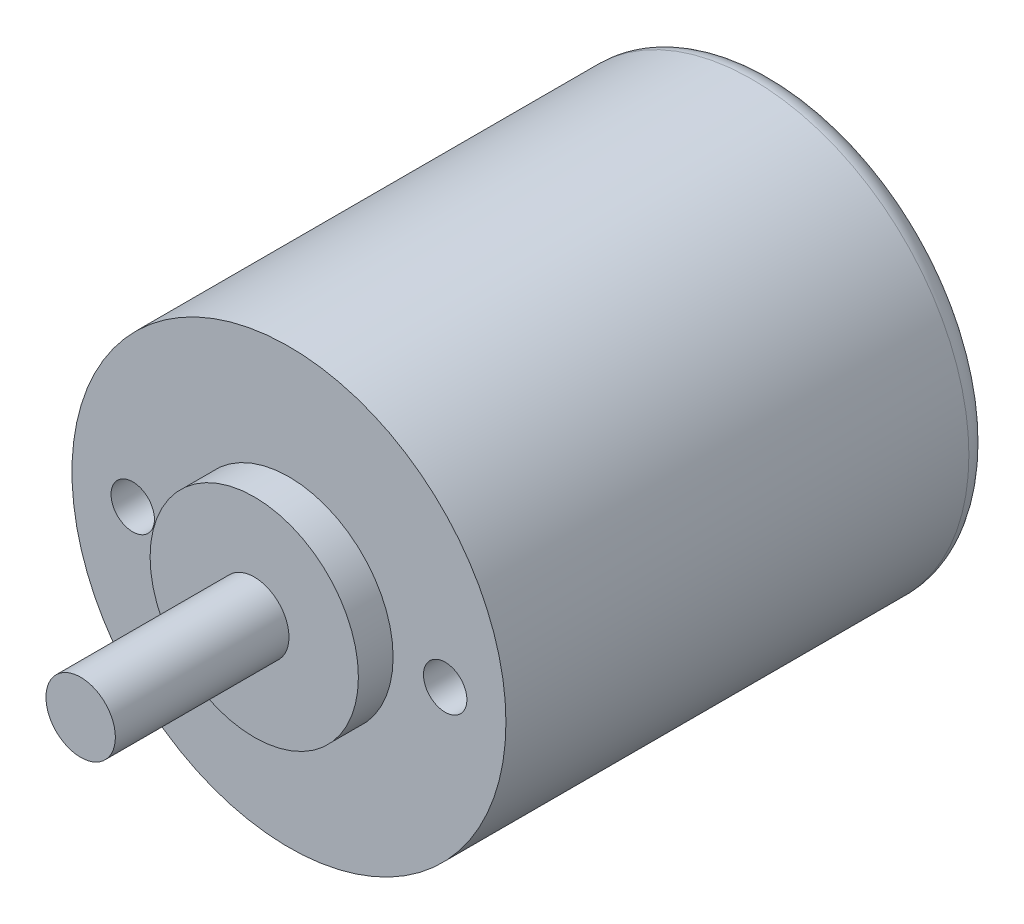
ISO-10303-21;
HEADER;
FILE_DESCRIPTION(('STEP AP214'),'2;1');
FILE_NAME('part.step','',(''),(''),'','','');
FILE_SCHEMA(('AUTOMOTIVE_DESIGN { 1 0 10303 214 1 1 1 1 }'));
ENDSEC;
DATA;
#1=APPLICATION_CONTEXT('core data for automotive mechanical design processes');
#2=APPLICATION_PROTOCOL_DEFINITION('international standard','automotive_design',2000,#1);
#3=PRODUCT_CONTEXT('',#1,'mechanical');
#4=PRODUCT('Part','Part','',(#3));
#5=PRODUCT_RELATED_PRODUCT_CATEGORY('part','',(#4));
#6=PRODUCT_DEFINITION_FORMATION('','',#4);
#7=PRODUCT_DEFINITION_CONTEXT('part definition',#1,'design');
#8=PRODUCT_DEFINITION('design','',#6,#7);
#9=PRODUCT_DEFINITION_SHAPE('','',#8);
#10=(LENGTH_UNIT() NAMED_UNIT(*) SI_UNIT(.MILLI.,.METRE.));
#11=(NAMED_UNIT(*) PLANE_ANGLE_UNIT() SI_UNIT($,.RADIAN.));
#12=(NAMED_UNIT(*) SI_UNIT($,.STERADIAN.) SOLID_ANGLE_UNIT());
#13=UNCERTAINTY_MEASURE_WITH_UNIT(LENGTH_MEASURE(1.E-05),#10,'distance_accuracy_value','');
#14=(GEOMETRIC_REPRESENTATION_CONTEXT(3) GLOBAL_UNCERTAINTY_ASSIGNED_CONTEXT((#13)) GLOBAL_UNIT_ASSIGNED_CONTEXT((#10,
#11,#12)) REPRESENTATION_CONTEXT('',''));
#15=CARTESIAN_POINT('',(0.,0.,0.));
#16=DIRECTION('',(0.,0.,1.));
#17=DIRECTION('',(1.,0.,0.));
#18=AXIS2_PLACEMENT_3D('',#15,#16,#17);
#19=CARTESIAN_POINT('',(0.,0.,29.94));
#20=DIRECTION('',(0.,0.,1.));
#21=DIRECTION('',(1.,0.,0.));
#22=AXIS2_PLACEMENT_3D('',#19,#20,#21);
#23=PLANE('',#22);
#24=CARTESIAN_POINT('',(0.,0.,29.94));
#25=DIRECTION('',(0.,0.,1.));
#26=DIRECTION('',(1.,0.,0.));
#27=AXIS2_PLACEMENT_3D('',#24,#25,#26);
#28=CIRCLE('',#27,6.);
#29=CARTESIAN_POINT('',(6.,0.,29.94));
#30=VERTEX_POINT('',#29);
#31=EDGE_CURVE('E96',#30,#30,#28,.T.);
#32=ORIENTED_EDGE('',*,*,#31,.T.);
#33=EDGE_LOOP('',(#32));
#34=FACE_BOUND('',#33,.T.);
#35=CARTESIAN_POINT('',(0.,0.,29.94));
#36=DIRECTION('',(0.,0.,1.));
#37=DIRECTION('',(1.,0.,0.));
#38=AXIS2_PLACEMENT_3D('',#35,#36,#37);
#39=CIRCLE('',#38,2.);
#40=CARTESIAN_POINT('',(2.,0.,29.94));
#41=VERTEX_POINT('',#40);
#42=EDGE_CURVE('E88',#41,#41,#39,.T.);
#43=ORIENTED_EDGE('',*,*,#42,.F.);
#44=EDGE_LOOP('',(#43));
#45=FACE_BOUND('',#44,.T.);
#46=ADVANCED_FACE('F44',(#34,#45),#23,.T.);
#47=CARTESIAN_POINT('',(0.,0.,27.94));
#48=DIRECTION('',(0.,0.,1.));
#49=DIRECTION('',(1.,0.,0.));
#50=AXIS2_PLACEMENT_3D('',#47,#48,#49);
#51=PLANE('',#50);
#52=CARTESIAN_POINT('',(-9.,0.,27.94));
#53=DIRECTION('',(0.,0.,1.));
#54=DIRECTION('',(1.,0.,0.));
#55=AXIS2_PLACEMENT_3D('',#52,#53,#54);
#56=CIRCLE('',#55,1.25);
#57=CARTESIAN_POINT('',(-7.75,0.,27.94));
#58=VERTEX_POINT('',#57);
#59=EDGE_CURVE('E73',#58,#58,#56,.T.);
#60=ORIENTED_EDGE('',*,*,#59,.F.);
#61=EDGE_LOOP('',(#60));
#62=FACE_BOUND('',#61,.T.);
#63=CARTESIAN_POINT('',(9.,0.,27.94));
#64=DIRECTION('',(0.,0.,1.));
#65=DIRECTION('',(1.,0.,0.));
#66=AXIS2_PLACEMENT_3D('',#63,#64,#65);
#67=CIRCLE('',#66,1.25);
#68=CARTESIAN_POINT('',(10.25,0.,27.94));
#69=VERTEX_POINT('',#68);
#70=EDGE_CURVE('E72',#69,#69,#67,.T.);
#71=ORIENTED_EDGE('',*,*,#70,.F.);
#72=EDGE_LOOP('',(#71));
#73=FACE_BOUND('',#72,.T.);
#74=CARTESIAN_POINT('',(0.,0.,27.94));
#75=DIRECTION('',(0.,0.,1.));
#76=DIRECTION('',(1.,0.,0.));
#77=AXIS2_PLACEMENT_3D('',#74,#75,#76);
#78=CIRCLE('',#77,12.5);
#79=CARTESIAN_POINT('',(12.5,0.,27.94));
#80=VERTEX_POINT('',#79);
#81=EDGE_CURVE('E100',#80,#80,#78,.T.);
#82=ORIENTED_EDGE('',*,*,#81,.T.);
#83=EDGE_LOOP('',(#82));
#84=FACE_BOUND('',#83,.T.);
#85=CARTESIAN_POINT('',(0.,0.,27.94));
#86=DIRECTION('',(0.,0.,1.));
#87=DIRECTION('',(1.,0.,0.));
#88=AXIS2_PLACEMENT_3D('',#85,#86,#87);
#89=CIRCLE('',#88,6.);
#90=CARTESIAN_POINT('',(6.,0.,27.94));
#91=VERTEX_POINT('',#90);
#92=EDGE_CURVE('E93',#91,#91,#89,.T.);
#93=ORIENTED_EDGE('',*,*,#92,.F.);
#94=EDGE_LOOP('',(#93));
#95=FACE_BOUND('',#94,.T.);
#96=ADVANCED_FACE('F120',(#62,#73,#84,#95),#51,.T.);
#97=CARTESIAN_POINT('',(0.,0.,27.94));
#98=DIRECTION('',(0.,0.,-1.));
#99=DIRECTION('',(-1.,0.,0.));
#100=AXIS2_PLACEMENT_3D('',#97,#98,#99);
#101=CYLINDRICAL_SURFACE('',#100,12.5);
#102=CARTESIAN_POINT('',(0.,0.,1.26999999999999));
#103=DIRECTION('',(0.,0.,1.));
#104=DIRECTION('',(1.,0.,0.));
#105=AXIS2_PLACEMENT_3D('',#102,#103,#104);
#106=CIRCLE('',#105,12.5);
#107=CARTESIAN_POINT('',(12.5,0.,1.26999999999999));
#108=VERTEX_POINT('',#107);
#109=EDGE_CURVE('E53',#108,#108,#106,.T.);
#110=ORIENTED_EDGE('',*,*,#109,.T.);
#111=EDGE_LOOP('',(#110));
#112=FACE_BOUND('',#111,.T.);
#113=ORIENTED_EDGE('',*,*,#81,.F.);
#114=EDGE_LOOP('',(#113));
#115=FACE_BOUND('',#114,.T.);
#116=ADVANCED_FACE('F109',(#112,#115),#101,.T.);
#117=CARTESIAN_POINT('',(0.,0.,0.));
#118=DIRECTION('',(0.,0.,1.));
#119=DIRECTION('',(1.,0.,0.));
#120=AXIS2_PLACEMENT_3D('',#117,#118,#119);
#121=PLANE('',#120);
#122=CARTESIAN_POINT('',(0.,0.,0.));
#123=DIRECTION('',(0.,0.,1.));
#124=DIRECTION('',(1.,0.,0.));
#125=AXIS2_PLACEMENT_3D('',#122,#123,#124);
#126=CIRCLE('',#125,11.23);
#127=CARTESIAN_POINT('',(11.23,0.,0.));
#128=VERTEX_POINT('',#127);
#129=EDGE_CURVE('E11',#128,#128,#126,.F.);
#130=ORIENTED_EDGE('',*,*,#129,.T.);
#131=EDGE_LOOP('',(#130));
#132=FACE_BOUND('',#131,.T.);
#133=ADVANCED_FACE('F135',(#132),#121,.F.);
#134=CARTESIAN_POINT('',(0.,0.,29.94));
#135=DIRECTION('',(0.,0.,-1.));
#136=DIRECTION('',(-1.,0.,0.));
#137=AXIS2_PLACEMENT_3D('',#134,#135,#136);
#138=CYLINDRICAL_SURFACE('',#137,6.);
#139=ORIENTED_EDGE('',*,*,#31,.F.);
#140=EDGE_LOOP('',(#139));
#141=FACE_BOUND('',#140,.T.);
#142=ORIENTED_EDGE('',*,*,#92,.T.);
#143=EDGE_LOOP('',(#142));
#144=FACE_BOUND('',#143,.T.);
#145=ADVANCED_FACE('F133',(#141,#144),#138,.T.);
#146=CARTESIAN_POINT('',(0.,0.,39.94));
#147=DIRECTION('',(0.,0.,-1.));
#148=DIRECTION('',(-1.,0.,0.));
#149=AXIS2_PLACEMENT_3D('',#146,#147,#148);
#150=CYLINDRICAL_SURFACE('',#149,2.);
#151=CARTESIAN_POINT('',(0.,0.,39.94));
#152=DIRECTION('',(0.,0.,1.));
#153=DIRECTION('',(1.,0.,0.));
#154=AXIS2_PLACEMENT_3D('',#151,#152,#153);
#155=CIRCLE('',#154,2.);
#156=CARTESIAN_POINT('',(2.,0.,39.94));
#157=VERTEX_POINT('',#156);
#158=EDGE_CURVE('E89',#157,#157,#155,.T.);
#159=ORIENTED_EDGE('',*,*,#158,.F.);
#160=EDGE_LOOP('',(#159));
#161=FACE_BOUND('',#160,.T.);
#162=ORIENTED_EDGE('',*,*,#42,.T.);
#163=EDGE_LOOP('',(#162));
#164=FACE_BOUND('',#163,.T.);
#165=ADVANCED_FACE('F131',(#161,#164),#150,.T.);
#166=CARTESIAN_POINT('',(0.,0.,39.94));
#167=DIRECTION('',(0.,0.,1.));
#168=DIRECTION('',(1.,0.,0.));
#169=AXIS2_PLACEMENT_3D('',#166,#167,#168);
#170=PLANE('',#169);
#171=ORIENTED_EDGE('',*,*,#158,.T.);
#172=EDGE_LOOP('',(#171));
#173=FACE_BOUND('',#172,.T.);
#174=ADVANCED_FACE('F157',(#173),#170,.T.);
#175=CARTESIAN_POINT('',(9.,0.,23.940008));
#176=DIRECTION('',(0.,0.,1.));
#177=DIRECTION('',(1.,0.,0.));
#178=AXIS2_PLACEMENT_3D('',#175,#176,#177);
#179=CONICAL_SURFACE('',#178,1.25,1.02974425867665);
#180=CARTESIAN_POINT('',(9.,0.,23.1889322262155));
#181=VERTEX_POINT('',#180);
#182=VERTEX_LOOP('',#181);
#183=FACE_BOUND('',#182,.T.);
#184=CARTESIAN_POINT('',(9.,0.,23.940008));
#185=DIRECTION('',(0.,0.,1.));
#186=DIRECTION('',(1.,0.,0.));
#187=AXIS2_PLACEMENT_3D('',#184,#185,#186);
#188=CIRCLE('',#187,1.25);
#189=CARTESIAN_POINT('',(10.25,0.,23.940008));
#190=VERTEX_POINT('',#189);
#191=EDGE_CURVE('E79',#190,#190,#188,.T.);
#192=ORIENTED_EDGE('',*,*,#191,.T.);
#193=EDGE_LOOP('',(#192));
#194=FACE_BOUND('',#193,.T.);
#195=ADVANCED_FACE('F163',(#183,#194),#179,.F.);
#196=CARTESIAN_POINT('',(9.,0.,27.94));
#197=DIRECTION('',(0.,0.,1.));
#198=DIRECTION('',(1.,0.,0.));
#199=AXIS2_PLACEMENT_3D('',#196,#197,#198);
#200=CYLINDRICAL_SURFACE('',#199,1.25);
#201=ORIENTED_EDGE('',*,*,#191,.F.);
#202=EDGE_LOOP('',(#201));
#203=FACE_BOUND('',#202,.T.);
#204=ORIENTED_EDGE('',*,*,#70,.T.);
#205=EDGE_LOOP('',(#204));
#206=FACE_BOUND('',#205,.T.);
#207=ADVANCED_FACE('F65',(#203,#206),#200,.F.);
#208=CARTESIAN_POINT('',(-9.,0.,23.940008));
#209=DIRECTION('',(0.,0.,1.));
#210=DIRECTION('',(1.,0.,0.));
#211=AXIS2_PLACEMENT_3D('',#208,#209,#210);
#212=CONICAL_SURFACE('',#211,1.25,1.02974425867665);
#213=CARTESIAN_POINT('',(-9.,0.,23.1889322262155));
#214=VERTEX_POINT('',#213);
#215=VERTEX_LOOP('',#214);
#216=FACE_BOUND('',#215,.T.);
#217=CARTESIAN_POINT('',(-9.,0.,23.940008));
#218=DIRECTION('',(0.,0.,1.));
#219=DIRECTION('',(1.,0.,0.));
#220=AXIS2_PLACEMENT_3D('',#217,#218,#219);
#221=CIRCLE('',#220,1.25);
#222=CARTESIAN_POINT('',(-7.75,0.,23.940008));
#223=VERTEX_POINT('',#222);
#224=EDGE_CURVE('E69',#223,#223,#221,.T.);
#225=ORIENTED_EDGE('',*,*,#224,.T.);
#226=EDGE_LOOP('',(#225));
#227=FACE_BOUND('',#226,.T.);
#228=ADVANCED_FACE('F61',(#216,#227),#212,.F.);
#229=CARTESIAN_POINT('',(-9.,0.,27.94));
#230=DIRECTION('',(0.,0.,1.));
#231=DIRECTION('',(1.,0.,0.));
#232=AXIS2_PLACEMENT_3D('',#229,#230,#231);
#233=CYLINDRICAL_SURFACE('',#232,1.25);
#234=ORIENTED_EDGE('',*,*,#224,.F.);
#235=EDGE_LOOP('',(#234));
#236=FACE_BOUND('',#235,.T.);
#237=ORIENTED_EDGE('',*,*,#59,.T.);
#238=EDGE_LOOP('',(#237));
#239=FACE_BOUND('',#238,.T.);
#240=ADVANCED_FACE('F64',(#236,#239),#233,.F.);
#241=CARTESIAN_POINT('',(0.,0.,1.26999999999999));
#242=DIRECTION('',(0.,0.,1.));
#243=DIRECTION('',(1.,0.,0.));
#244=AXIS2_PLACEMENT_3D('',#241,#242,#243);
#245=TOROIDAL_SURFACE('',#244,11.23,1.27);
#246=ORIENTED_EDGE('',*,*,#129,.F.);
#247=EDGE_LOOP('',(#246));
#248=FACE_BOUND('',#247,.T.);
#249=ORIENTED_EDGE('',*,*,#109,.F.);
#250=EDGE_LOOP('',(#249));
#251=FACE_BOUND('',#250,.T.);
#252=ADVANCED_FACE('F46',(#248,#251),#245,.T.);
#253=CLOSED_SHELL('',(#46,#96,#116,#133,#145,#165,#174,#195,#207,#228,#240,#252));
#254=MANIFOLD_SOLID_BREP('B2',#253);
#255=ADVANCED_BREP_SHAPE_REPRESENTATION('',(#18,#254),#14);
#256=SHAPE_DEFINITION_REPRESENTATION(#9,#255);
ENDSEC;
END-ISO-10303-21;
